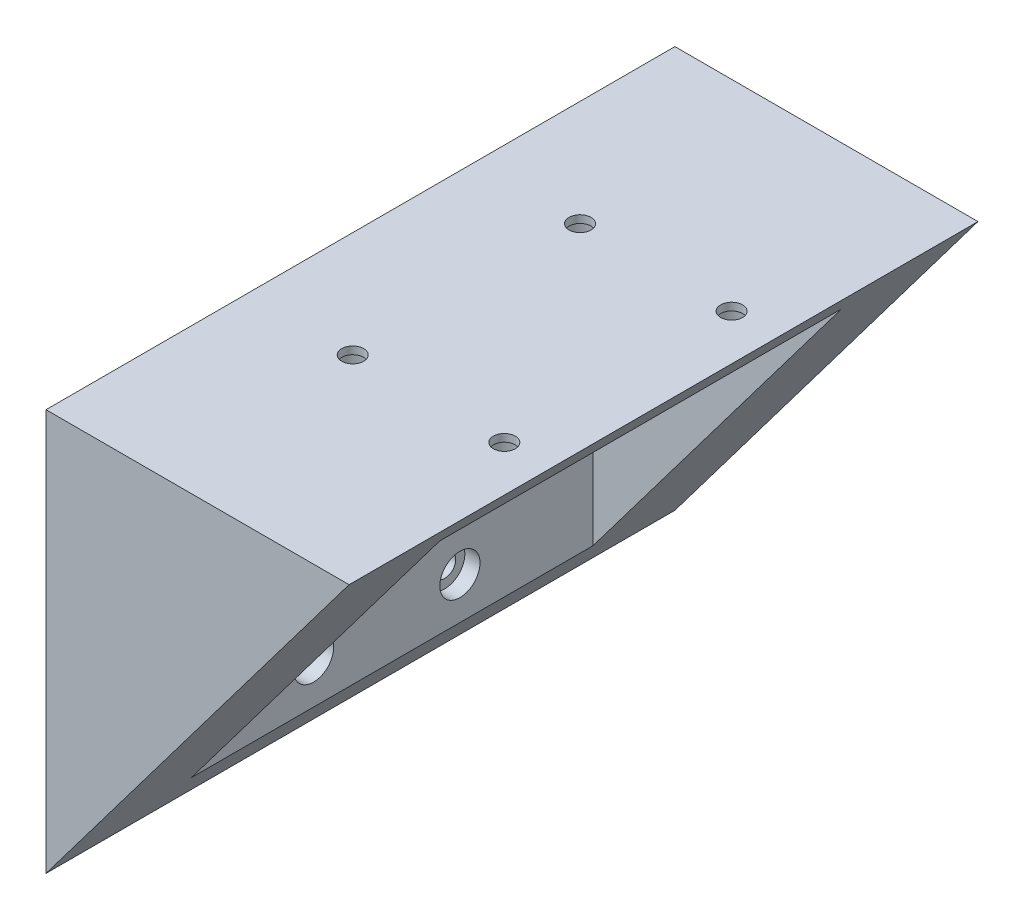
ISO-10303-21;
HEADER;
FILE_DESCRIPTION(('STEP AP214'),'2;1');
FILE_NAME('part.step','',(''),(''),'','','');
FILE_SCHEMA(('AUTOMOTIVE_DESIGN { 1 0 10303 214 1 1 1 1 }'));
ENDSEC;
DATA;
#1=APPLICATION_CONTEXT('core data for automotive mechanical design processes');
#2=APPLICATION_PROTOCOL_DEFINITION('international standard','automotive_design',2000,#1);
#3=PRODUCT_CONTEXT('',#1,'mechanical');
#4=PRODUCT('Part','Part','',(#3));
#5=PRODUCT_RELATED_PRODUCT_CATEGORY('part','',(#4));
#6=PRODUCT_DEFINITION_FORMATION('','',#4);
#7=PRODUCT_DEFINITION_CONTEXT('part definition',#1,'design');
#8=PRODUCT_DEFINITION('design','',#6,#7);
#9=PRODUCT_DEFINITION_SHAPE('','',#8);
#10=(LENGTH_UNIT() NAMED_UNIT(*) SI_UNIT(.MILLI.,.METRE.));
#11=(NAMED_UNIT(*) PLANE_ANGLE_UNIT() SI_UNIT($,.RADIAN.));
#12=(NAMED_UNIT(*) SI_UNIT($,.STERADIAN.) SOLID_ANGLE_UNIT());
#13=UNCERTAINTY_MEASURE_WITH_UNIT(LENGTH_MEASURE(1.E-05),#10,'distance_accuracy_value','');
#14=(GEOMETRIC_REPRESENTATION_CONTEXT(3) GLOBAL_UNCERTAINTY_ASSIGNED_CONTEXT((#13)) GLOBAL_UNIT_ASSIGNED_CONTEXT((#10,
#11,#12)) REPRESENTATION_CONTEXT('',''));
#15=CARTESIAN_POINT('',(0.,0.,0.));
#16=DIRECTION('',(0.,0.,1.));
#17=DIRECTION('',(1.,0.,0.));
#18=AXIS2_PLACEMENT_3D('',#15,#16,#17);
#19=CARTESIAN_POINT('',(-5.82641509433961,-28.6868552036199,51.86));
#20=DIRECTION('',(1.,0.,0.));
#21=DIRECTION('',(0.,1.,0.));
#22=AXIS2_PLACEMENT_3D('',#19,#20,#21);
#23=CYLINDRICAL_SURFACE('',#22,1.45);
#24=CARTESIAN_POINT('',(0.,-28.6868552036199,51.86));
#25=DIRECTION('',(1.,0.,0.));
#26=DIRECTION('',(0.,1.,0.));
#27=AXIS2_PLACEMENT_3D('',#24,#25,#26);
#28=CIRCLE('',#27,1.45);
#29=CARTESIAN_POINT('',(0.,-27.2368552036199,51.86));
#30=VERTEX_POINT('',#29);
#31=EDGE_CURVE('E201',#30,#30,#28,.T.);
#32=ORIENTED_EDGE('',*,*,#31,.F.);
#33=EDGE_LOOP('',(#32));
#34=FACE_BOUND('',#33,.T.);
#35=CARTESIAN_POINT('',(2.17358490566039,-28.6868552036199,51.86));
#36=DIRECTION('',(1.,0.,0.));
#37=DIRECTION('',(0.,1.,0.));
#38=AXIS2_PLACEMENT_3D('',#35,#36,#37);
#39=CIRCLE('',#38,1.45);
#40=CARTESIAN_POINT('',(2.17358490566039,-27.2368552036199,51.86));
#41=VERTEX_POINT('',#40);
#42=EDGE_CURVE('E36',#41,#41,#39,.F.);
#43=ORIENTED_EDGE('',*,*,#42,.F.);
#44=EDGE_LOOP('',(#43));
#45=FACE_BOUND('',#44,.T.);
#46=ADVANCED_FACE('F32',(#34,#45),#23,.F.);
#47=CARTESIAN_POINT('',(-5.82641509433961,-39.6368552036199,51.86));
#48=DIRECTION('',(1.,0.,0.));
#49=DIRECTION('',(0.,1.,0.));
#50=AXIS2_PLACEMENT_3D('',#47,#48,#49);
#51=CYLINDRICAL_SURFACE('',#50,1.45);
#52=CARTESIAN_POINT('',(0.,-39.6368552036199,51.86));
#53=DIRECTION('',(1.,0.,0.));
#54=DIRECTION('',(0.,1.,0.));
#55=AXIS2_PLACEMENT_3D('',#52,#53,#54);
#56=CIRCLE('',#55,1.45);
#57=CARTESIAN_POINT('',(0.,-38.1868552036199,51.86));
#58=VERTEX_POINT('',#57);
#59=EDGE_CURVE('E204',#58,#58,#56,.T.);
#60=ORIENTED_EDGE('',*,*,#59,.F.);
#61=EDGE_LOOP('',(#60));
#62=FACE_BOUND('',#61,.T.);
#63=CARTESIAN_POINT('',(2.17358490566039,-39.6368552036199,51.86));
#64=DIRECTION('',(1.,0.,0.));
#65=DIRECTION('',(0.,1.,0.));
#66=AXIS2_PLACEMENT_3D('',#63,#64,#65);
#67=CIRCLE('',#66,1.45);
#68=CARTESIAN_POINT('',(2.17358490566039,-38.1868552036199,51.86));
#69=VERTEX_POINT('',#68);
#70=EDGE_CURVE('E156',#69,#69,#67,.F.);
#71=ORIENTED_EDGE('',*,*,#70,.F.);
#72=EDGE_LOOP('',(#71));
#73=FACE_BOUND('',#72,.T.);
#74=ADVANCED_FACE('F233',(#62,#73),#51,.F.);
#75=CARTESIAN_POINT('',(-5.82641509433961,-39.6368552036199,32.5485809376953));
#76=DIRECTION('',(1.,0.,0.));
#77=DIRECTION('',(0.,1.,0.));
#78=AXIS2_PLACEMENT_3D('',#75,#76,#77);
#79=CYLINDRICAL_SURFACE('',#78,1.45);
#80=CARTESIAN_POINT('',(0.,-39.6368552036199,32.5485809376953));
#81=DIRECTION('',(1.,0.,0.));
#82=DIRECTION('',(0.,1.,0.));
#83=AXIS2_PLACEMENT_3D('',#80,#81,#82);
#84=CIRCLE('',#83,1.45);
#85=CARTESIAN_POINT('',(0.,-38.1868552036199,32.5485809376953));
#86=VERTEX_POINT('',#85);
#87=EDGE_CURVE('E207',#86,#86,#84,.T.);
#88=ORIENTED_EDGE('',*,*,#87,.F.);
#89=EDGE_LOOP('',(#88));
#90=FACE_BOUND('',#89,.T.);
#91=CARTESIAN_POINT('',(2.17358490566039,-39.6368552036199,32.5485809376953));
#92=DIRECTION('',(1.,0.,0.));
#93=DIRECTION('',(0.,1.,0.));
#94=AXIS2_PLACEMENT_3D('',#91,#92,#93);
#95=CIRCLE('',#94,1.45);
#96=CARTESIAN_POINT('',(2.17358490566039,-38.1868552036199,32.5485809376953));
#97=VERTEX_POINT('',#96);
#98=EDGE_CURVE('E153',#97,#97,#95,.F.);
#99=ORIENTED_EDGE('',*,*,#98,.F.);
#100=EDGE_LOOP('',(#99));
#101=FACE_BOUND('',#100,.T.);
#102=ADVANCED_FACE('F240',(#90,#101),#79,.F.);
#103=CARTESIAN_POINT('',(-5.82641509433961,-28.6868552036199,32.5485809376953));
#104=DIRECTION('',(1.,0.,0.));
#105=DIRECTION('',(0.,1.,0.));
#106=AXIS2_PLACEMENT_3D('',#103,#104,#105);
#107=CYLINDRICAL_SURFACE('',#106,1.45);
#108=CARTESIAN_POINT('',(0.,-28.6868552036199,32.5485809376953));
#109=DIRECTION('',(1.,0.,0.));
#110=DIRECTION('',(0.,1.,0.));
#111=AXIS2_PLACEMENT_3D('',#108,#109,#110);
#112=CIRCLE('',#111,1.45);
#113=CARTESIAN_POINT('',(0.,-27.2368552036199,32.5485809376953));
#114=VERTEX_POINT('',#113);
#115=EDGE_CURVE('E210',#114,#114,#112,.T.);
#116=ORIENTED_EDGE('',*,*,#115,.F.);
#117=EDGE_LOOP('',(#116));
#118=FACE_BOUND('',#117,.T.);
#119=CARTESIAN_POINT('',(2.17358490566039,-28.6868552036199,32.5485809376953));
#120=DIRECTION('',(1.,0.,0.));
#121=DIRECTION('',(0.,1.,0.));
#122=AXIS2_PLACEMENT_3D('',#119,#120,#121);
#123=CIRCLE('',#122,1.45);
#124=CARTESIAN_POINT('',(2.17358490566039,-27.2368552036199,32.5485809376953));
#125=VERTEX_POINT('',#124);
#126=EDGE_CURVE('E150',#125,#125,#123,.F.);
#127=ORIENTED_EDGE('',*,*,#126,.F.);
#128=EDGE_LOOP('',(#127));
#129=FACE_BOUND('',#128,.T.);
#130=ADVANCED_FACE('F246',(#118,#129),#107,.F.);
#131=CARTESIAN_POINT('',(33.9811320754717,8.33314479638009,56.5));
#132=DIRECTION('',(0.,-1.,0.));
#133=DIRECTION('',(1.,0.,0.));
#134=AXIS2_PLACEMENT_3D('',#131,#132,#133);
#135=CYLINDRICAL_SURFACE('',#134,1.45);
#136=CARTESIAN_POINT('',(33.9811320754717,2.33314479638009,56.5));
#137=DIRECTION('',(0.,-1.,0.));
#138=DIRECTION('',(0.,0.,-1.));
#139=AXIS2_PLACEMENT_3D('',#136,#137,#138);
#140=CIRCLE('',#139,1.45);
#141=CARTESIAN_POINT('',(33.9811320754717,2.33314479638009,55.05));
#142=VERTEX_POINT('',#141);
#143=EDGE_CURVE('E149',#142,#142,#140,.T.);
#144=ORIENTED_EDGE('',*,*,#143,.F.);
#145=EDGE_LOOP('',(#144));
#146=FACE_BOUND('',#145,.T.);
#147=CARTESIAN_POINT('',(33.9811320754717,1.33314479638009,56.5));
#148=DIRECTION('',(0.,-1.,0.));
#149=DIRECTION('',(1.,0.,0.));
#150=AXIS2_PLACEMENT_3D('',#147,#148,#149);
#151=CIRCLE('',#150,1.45);
#152=CARTESIAN_POINT('',(35.4311320754717,1.33314479638009,56.5));
#153=VERTEX_POINT('',#152);
#154=EDGE_CURVE('E146',#153,#153,#151,.F.);
#155=ORIENTED_EDGE('',*,*,#154,.F.);
#156=EDGE_LOOP('',(#155));
#157=FACE_BOUND('',#156,.T.);
#158=ADVANCED_FACE('F249',(#146,#157),#135,.F.);
#159=CARTESIAN_POINT('',(13.9811320754717,8.33314479638009,56.5));
#160=DIRECTION('',(0.,-1.,0.));
#161=DIRECTION('',(1.,0.,0.));
#162=AXIS2_PLACEMENT_3D('',#159,#160,#161);
#163=CYLINDRICAL_SURFACE('',#162,1.45);
#164=CARTESIAN_POINT('',(13.9811320754717,2.33314479638009,56.5));
#165=DIRECTION('',(0.,-1.,0.));
#166=DIRECTION('',(0.,0.,-1.));
#167=AXIS2_PLACEMENT_3D('',#164,#165,#166);
#168=CIRCLE('',#167,1.45);
#169=CARTESIAN_POINT('',(13.9811320754717,2.33314479638009,55.05));
#170=VERTEX_POINT('',#169);
#171=EDGE_CURVE('E192',#170,#170,#168,.T.);
#172=ORIENTED_EDGE('',*,*,#171,.F.);
#173=EDGE_LOOP('',(#172));
#174=FACE_BOUND('',#173,.T.);
#175=CARTESIAN_POINT('',(13.9811320754717,1.33314479638009,56.5));
#176=DIRECTION('',(0.,-1.,0.));
#177=DIRECTION('',(1.,0.,0.));
#178=AXIS2_PLACEMENT_3D('',#175,#176,#177);
#179=CIRCLE('',#178,1.45);
#180=CARTESIAN_POINT('',(15.4311320754717,1.33314479638009,56.5));
#181=VERTEX_POINT('',#180);
#182=EDGE_CURVE('E143',#181,#181,#179,.F.);
#183=ORIENTED_EDGE('',*,*,#182,.F.);
#184=EDGE_LOOP('',(#183));
#185=FACE_BOUND('',#184,.T.);
#186=ADVANCED_FACE('F256',(#174,#185),#163,.F.);
#187=CARTESIAN_POINT('',(13.9811320754717,8.33314479638009,26.5));
#188=DIRECTION('',(0.,-1.,0.));
#189=DIRECTION('',(1.,0.,0.));
#190=AXIS2_PLACEMENT_3D('',#187,#188,#189);
#191=CYLINDRICAL_SURFACE('',#190,1.45);
#192=CARTESIAN_POINT('',(13.9811320754717,2.33314479638009,26.5));
#193=DIRECTION('',(0.,-1.,0.));
#194=DIRECTION('',(0.,0.,-1.));
#195=AXIS2_PLACEMENT_3D('',#192,#193,#194);
#196=CIRCLE('',#195,1.45);
#197=CARTESIAN_POINT('',(13.9811320754717,2.33314479638009,25.05));
#198=VERTEX_POINT('',#197);
#199=EDGE_CURVE('E195',#198,#198,#196,.T.);
#200=ORIENTED_EDGE('',*,*,#199,.F.);
#201=EDGE_LOOP('',(#200));
#202=FACE_BOUND('',#201,.T.);
#203=CARTESIAN_POINT('',(13.9811320754717,1.33314479638009,26.5));
#204=DIRECTION('',(0.,-1.,0.));
#205=DIRECTION('',(1.,0.,0.));
#206=AXIS2_PLACEMENT_3D('',#203,#204,#205);
#207=CIRCLE('',#206,1.45);
#208=CARTESIAN_POINT('',(15.4311320754717,1.33314479638009,26.5));
#209=VERTEX_POINT('',#208);
#210=EDGE_CURVE('E139',#209,#209,#207,.F.);
#211=ORIENTED_EDGE('',*,*,#210,.F.);
#212=EDGE_LOOP('',(#211));
#213=FACE_BOUND('',#212,.T.);
#214=ADVANCED_FACE('F261',(#202,#213),#191,.F.);
#215=CARTESIAN_POINT('',(33.9811320754717,8.33314479638009,26.5));
#216=DIRECTION('',(0.,-1.,0.));
#217=DIRECTION('',(1.,0.,0.));
#218=AXIS2_PLACEMENT_3D('',#215,#216,#217);
#219=CYLINDRICAL_SURFACE('',#218,1.45);
#220=CARTESIAN_POINT('',(33.9811320754717,2.33314479638009,26.5));
#221=DIRECTION('',(0.,-1.,0.));
#222=DIRECTION('',(0.,0.,-1.));
#223=AXIS2_PLACEMENT_3D('',#220,#221,#222);
#224=CIRCLE('',#223,1.45);
#225=CARTESIAN_POINT('',(33.9811320754717,2.33314479638009,25.05));
#226=VERTEX_POINT('',#225);
#227=EDGE_CURVE('E198',#226,#226,#224,.T.);
#228=ORIENTED_EDGE('',*,*,#227,.F.);
#229=EDGE_LOOP('',(#228));
#230=FACE_BOUND('',#229,.T.);
#231=CARTESIAN_POINT('',(33.9811320754717,1.33314479638009,26.5));
#232=DIRECTION('',(0.,-1.,0.));
#233=DIRECTION('',(1.,0.,0.));
#234=AXIS2_PLACEMENT_3D('',#231,#232,#233);
#235=CIRCLE('',#234,1.45);
#236=CARTESIAN_POINT('',(35.4311320754717,1.33314479638009,26.5));
#237=VERTEX_POINT('',#236);
#238=EDGE_CURVE('E136',#237,#237,#235,.F.);
#239=ORIENTED_EDGE('',*,*,#238,.F.);
#240=EDGE_LOOP('',(#239));
#241=FACE_BOUND('',#240,.T.);
#242=ADVANCED_FACE('F258',(#230,#241),#219,.F.);
#243=CARTESIAN_POINT('',(40.,2.33314479638009,83.));
#244=DIRECTION('',(-0.798189150333231,0.602406905911872,0.));
#245=DIRECTION('',(-0.602406905911872,-0.798189150333231,0.));
#246=AXIS2_PLACEMENT_3D('',#243,#244,#245);
#247=PLANE('',#246);
#248=DIRECTION('',(0.602406905911872,0.798189150333231,0.));
#249=VECTOR('',#248,1.);
#250=CARTESIAN_POINT('',(40.,2.33314479638009,0.));
#251=LINE('',#250,#249);
#252=CARTESIAN_POINT('',(0.,-50.6668552036199,0.));
#253=VERTEX_POINT('',#252);
#254=CARTESIAN_POINT('',(40.,2.33314479638009,0.));
#255=VERTEX_POINT('',#254);
#256=EDGE_CURVE('E75',#253,#255,#251,.T.);
#257=ORIENTED_EDGE('',*,*,#256,.T.);
#258=DIRECTION('',(0.,0.,-1.));
#259=VECTOR('',#258,1.);
#260=CARTESIAN_POINT('',(40.,2.33314479638009,83.));
#261=LINE('',#260,#259);
#262=CARTESIAN_POINT('',(40.,2.33314479638009,83.));
#263=VERTEX_POINT('',#262);
#264=EDGE_CURVE('E127',#263,#255,#261,.T.);
#265=ORIENTED_EDGE('',*,*,#264,.F.);
#266=DIRECTION('',(0.602406905911872,0.798189150333231,0.));
#267=VECTOR('',#266,1.);
#268=CARTESIAN_POINT('',(40.,2.33314479638009,83.));
#269=LINE('',#268,#267);
#270=CARTESIAN_POINT('',(0.,-50.6668552036199,83.));
#271=VERTEX_POINT('',#270);
#272=EDGE_CURVE('E58',#271,#263,#269,.T.);
#273=ORIENTED_EDGE('',*,*,#272,.F.);
#274=DIRECTION('',(0.,0.,-1.));
#275=VECTOR('',#274,1.);
#276=CARTESIAN_POINT('',(0.,-50.6668552036199,83.));
#277=LINE('',#276,#275);
#278=EDGE_CURVE('E41',#271,#253,#277,.T.);
#279=ORIENTED_EDGE('',*,*,#278,.T.);
#280=EDGE_LOOP('',(#257,#265,#273,#279));
#281=FACE_BOUND('',#280,.T.);
#282=DIRECTION('',(0.602406905911872,0.798189150333231,0.));
#283=VECTOR('',#282,1.);
#284=CARTESIAN_POINT('',(4.17358490566039,-45.1368552036199,15.));
#285=LINE('',#284,#283);
#286=CARTESIAN_POINT('',(4.17358490566039,-45.1368552036199,15.));
#287=VERTEX_POINT('',#286);
#288=CARTESIAN_POINT('',(36.9811320754717,-1.66685520361991,15.));
#289=VERTEX_POINT('',#288);
#290=EDGE_CURVE('E107',#287,#289,#285,.T.);
#291=ORIENTED_EDGE('',*,*,#290,.F.);
#292=DIRECTION('',(0.,0.,1.));
#293=VECTOR('',#292,1.);
#294=CARTESIAN_POINT('',(4.17358490566039,-45.1368552036199,15.));
#295=LINE('',#294,#293);
#296=CARTESIAN_POINT('',(4.17358490566039,-45.1368552036199,68.));
#297=VERTEX_POINT('',#296);
#298=EDGE_CURVE('E118',#287,#297,#295,.T.);
#299=ORIENTED_EDGE('',*,*,#298,.T.);
#300=DIRECTION('',(0.602406905911872,0.798189150333231,0.));
#301=VECTOR('',#300,1.);
#302=CARTESIAN_POINT('',(4.17358490566039,-45.1368552036199,68.));
#303=LINE('',#302,#301);
#304=CARTESIAN_POINT('',(36.9811320754717,-1.66685520361991,68.));
#305=VERTEX_POINT('',#304);
#306=EDGE_CURVE('E116',#297,#305,#303,.T.);
#307=ORIENTED_EDGE('',*,*,#306,.T.);
#308=DIRECTION('',(0.,0.,1.));
#309=VECTOR('',#308,1.);
#310=CARTESIAN_POINT('',(36.9811320754717,-1.66685520361991,15.));
#311=LINE('',#310,#309);
#312=EDGE_CURVE('E100',#289,#305,#311,.T.);
#313=ORIENTED_EDGE('',*,*,#312,.F.);
#314=EDGE_LOOP('',(#291,#299,#307,#313));
#315=FACE_BOUND('',#314,.T.);
#316=ADVANCED_FACE('F115',(#281,#315),#247,.F.);
#317=CARTESIAN_POINT('',(0.,2.33314479638009,83.));
#318=DIRECTION('',(0.,-1.,0.));
#319=DIRECTION('',(0.,0.,-1.));
#320=AXIS2_PLACEMENT_3D('',#317,#318,#319);
#321=PLANE('',#320);
#322=ORIENTED_EDGE('',*,*,#227,.T.);
#323=EDGE_LOOP('',(#322));
#324=FACE_BOUND('',#323,.T.);
#325=ORIENTED_EDGE('',*,*,#199,.T.);
#326=EDGE_LOOP('',(#325));
#327=FACE_BOUND('',#326,.T.);
#328=ORIENTED_EDGE('',*,*,#171,.T.);
#329=EDGE_LOOP('',(#328));
#330=FACE_BOUND('',#329,.T.);
#331=ORIENTED_EDGE('',*,*,#143,.T.);
#332=EDGE_LOOP('',(#331));
#333=FACE_BOUND('',#332,.T.);
#334=DIRECTION('',(-1.,0.,0.));
#335=VECTOR('',#334,1.);
#336=CARTESIAN_POINT('',(0.,2.33314479638009,0.));
#337=LINE('',#336,#335);
#338=CARTESIAN_POINT('',(0.,2.33314479638009,0.));
#339=VERTEX_POINT('',#338);
#340=EDGE_CURVE('E128',#255,#339,#337,.T.);
#341=ORIENTED_EDGE('',*,*,#340,.T.);
#342=DIRECTION('',(0.,0.,-1.));
#343=VECTOR('',#342,1.);
#344=CARTESIAN_POINT('',(0.,2.33314479638009,83.));
#345=LINE('',#344,#343);
#346=CARTESIAN_POINT('',(0.,2.33314479638009,83.));
#347=VERTEX_POINT('',#346);
#348=EDGE_CURVE('E11',#347,#339,#345,.T.);
#349=ORIENTED_EDGE('',*,*,#348,.F.);
#350=DIRECTION('',(-1.,0.,0.));
#351=VECTOR('',#350,1.);
#352=CARTESIAN_POINT('',(0.,2.33314479638009,83.));
#353=LINE('',#352,#351);
#354=EDGE_CURVE('E123',#263,#347,#353,.T.);
#355=ORIENTED_EDGE('',*,*,#354,.F.);
#356=ORIENTED_EDGE('',*,*,#264,.T.);
#357=EDGE_LOOP('',(#341,#349,#355,#356));
#358=FACE_BOUND('',#357,.T.);
#359=ADVANCED_FACE('F34',(#324,#327,#330,#333,#358),#321,.F.);
#360=CARTESIAN_POINT('',(0.,2.33314479638009,83.));
#361=DIRECTION('',(1.,0.,0.));
#362=DIRECTION('',(0.,1.,0.));
#363=AXIS2_PLACEMENT_3D('',#360,#361,#362);
#364=PLANE('',#363);
#365=ORIENTED_EDGE('',*,*,#115,.T.);
#366=EDGE_LOOP('',(#365));
#367=FACE_BOUND('',#366,.T.);
#368=ORIENTED_EDGE('',*,*,#87,.T.);
#369=EDGE_LOOP('',(#368));
#370=FACE_BOUND('',#369,.T.);
#371=ORIENTED_EDGE('',*,*,#59,.T.);
#372=EDGE_LOOP('',(#371));
#373=FACE_BOUND('',#372,.T.);
#374=ORIENTED_EDGE('',*,*,#31,.T.);
#375=EDGE_LOOP('',(#374));
#376=FACE_BOUND('',#375,.T.);
#377=DIRECTION('',(0.,-1.,0.));
#378=VECTOR('',#377,1.);
#379=CARTESIAN_POINT('',(0.,2.33314479638009,0.));
#380=LINE('',#379,#378);
#381=EDGE_CURVE('E131',#339,#253,#380,.T.);
#382=ORIENTED_EDGE('',*,*,#381,.T.);
#383=ORIENTED_EDGE('',*,*,#278,.F.);
#384=DIRECTION('',(0.,-1.,0.));
#385=VECTOR('',#384,1.);
#386=CARTESIAN_POINT('',(0.,2.33314479638009,83.));
#387=LINE('',#386,#385);
#388=EDGE_CURVE('E80',#347,#271,#387,.T.);
#389=ORIENTED_EDGE('',*,*,#388,.F.);
#390=ORIENTED_EDGE('',*,*,#348,.T.);
#391=EDGE_LOOP('',(#382,#383,#389,#390));
#392=FACE_BOUND('',#391,.T.);
#393=ADVANCED_FACE('F375',(#367,#370,#373,#376,#392),#364,.F.);
#394=CARTESIAN_POINT('',(0.,0.,83.));
#395=DIRECTION('',(0.,0.,-1.));
#396=DIRECTION('',(-1.,0.,0.));
#397=AXIS2_PLACEMENT_3D('',#394,#395,#396);
#398=PLANE('',#397);
#399=ORIENTED_EDGE('',*,*,#354,.T.);
#400=ORIENTED_EDGE('',*,*,#388,.T.);
#401=ORIENTED_EDGE('',*,*,#272,.T.);
#402=EDGE_LOOP('',(#399,#400,#401));
#403=FACE_BOUND('',#402,.T.);
#404=ADVANCED_FACE('F368',(#403),#398,.F.);
#405=CARTESIAN_POINT('',(0.,0.,0.));
#406=DIRECTION('',(0.,0.,-1.));
#407=DIRECTION('',(-1.,0.,0.));
#408=AXIS2_PLACEMENT_3D('',#405,#406,#407);
#409=PLANE('',#408);
#410=ORIENTED_EDGE('',*,*,#340,.F.);
#411=ORIENTED_EDGE('',*,*,#256,.F.);
#412=ORIENTED_EDGE('',*,*,#381,.F.);
#413=EDGE_LOOP('',(#410,#411,#412));
#414=FACE_BOUND('',#413,.T.);
#415=ADVANCED_FACE('F359',(#414),#409,.T.);
#416=CARTESIAN_POINT('',(4.17358490566038,-1.66685520361991,15.));
#417=DIRECTION('',(-1.,0.,0.));
#418=DIRECTION('',(0.,-1.,0.));
#419=AXIS2_PLACEMENT_3D('',#416,#417,#418);
#420=PLANE('',#419);
#421=CARTESIAN_POINT('',(4.17358490566039,-28.6868552036199,32.5485809376953));
#422=DIRECTION('',(1.,0.,0.));
#423=DIRECTION('',(0.,1.,0.));
#424=AXIS2_PLACEMENT_3D('',#421,#422,#423);
#425=CIRCLE('',#424,2.65);
#426=CARTESIAN_POINT('',(4.17358490566039,-26.0368552036199,32.5485809376953));
#427=VERTEX_POINT('',#426);
#428=EDGE_CURVE('E348',#427,#427,#425,.T.);
#429=ORIENTED_EDGE('',*,*,#428,.F.);
#430=EDGE_LOOP('',(#429));
#431=FACE_BOUND('',#430,.T.);
#432=CARTESIAN_POINT('',(4.17358490566039,-39.6368552036199,51.86));
#433=DIRECTION('',(1.,0.,0.));
#434=DIRECTION('',(0.,1.,0.));
#435=AXIS2_PLACEMENT_3D('',#432,#433,#434);
#436=CIRCLE('',#435,2.65);
#437=CARTESIAN_POINT('',(4.17358490566039,-36.9868552036199,51.86));
#438=VERTEX_POINT('',#437);
#439=EDGE_CURVE('E335',#438,#438,#436,.T.);
#440=ORIENTED_EDGE('',*,*,#439,.F.);
#441=EDGE_LOOP('',(#440));
#442=FACE_BOUND('',#441,.T.);
#443=CARTESIAN_POINT('',(4.17358490566039,-39.6368552036199,32.5485809376953));
#444=DIRECTION('',(1.,0.,0.));
#445=DIRECTION('',(0.,1.,0.));
#446=AXIS2_PLACEMENT_3D('',#443,#444,#445);
#447=CIRCLE('',#446,2.65);
#448=CARTESIAN_POINT('',(4.17358490566039,-36.9868552036199,32.5485809376953));
#449=VERTEX_POINT('',#448);
#450=EDGE_CURVE('E336',#449,#449,#447,.T.);
#451=ORIENTED_EDGE('',*,*,#450,.F.);
#452=EDGE_LOOP('',(#451));
#453=FACE_BOUND('',#452,.T.);
#454=CARTESIAN_POINT('',(4.17358490566039,-28.6868552036199,51.86));
#455=DIRECTION('',(1.,0.,0.));
#456=DIRECTION('',(0.,1.,0.));
#457=AXIS2_PLACEMENT_3D('',#454,#455,#456);
#458=CIRCLE('',#457,2.65);
#459=CARTESIAN_POINT('',(4.17358490566039,-26.0368552036199,51.86));
#460=VERTEX_POINT('',#459);
#461=EDGE_CURVE('E347',#460,#460,#458,.T.);
#462=ORIENTED_EDGE('',*,*,#461,.F.);
#463=EDGE_LOOP('',(#462));
#464=FACE_BOUND('',#463,.T.);
#465=DIRECTION('',(0.,-1.,0.));
#466=VECTOR('',#465,1.);
#467=CARTESIAN_POINT('',(4.17358490566038,-1.66685520361991,68.));
#468=LINE('',#467,#466);
#469=CARTESIAN_POINT('',(4.17358490566038,-1.66685520361991,68.));
#470=VERTEX_POINT('',#469);
#471=EDGE_CURVE('E113',#470,#297,#468,.T.);
#472=ORIENTED_EDGE('',*,*,#471,.T.);
#473=ORIENTED_EDGE('',*,*,#298,.F.);
#474=DIRECTION('',(0.,-1.,0.));
#475=VECTOR('',#474,1.);
#476=CARTESIAN_POINT('',(4.17358490566038,-1.66685520361991,15.));
#477=LINE('',#476,#475);
#478=CARTESIAN_POINT('',(4.17358490566038,-1.66685520361991,15.));
#479=VERTEX_POINT('',#478);
#480=EDGE_CURVE('E106',#479,#287,#477,.T.);
#481=ORIENTED_EDGE('',*,*,#480,.F.);
#482=DIRECTION('',(0.,0.,1.));
#483=VECTOR('',#482,1.);
#484=CARTESIAN_POINT('',(4.17358490566038,-1.66685520361991,15.));
#485=LINE('',#484,#483);
#486=EDGE_CURVE('E102',#479,#470,#485,.T.);
#487=ORIENTED_EDGE('',*,*,#486,.T.);
#488=EDGE_LOOP('',(#472,#473,#481,#487));
#489=FACE_BOUND('',#488,.T.);
#490=ADVANCED_FACE('F217',(#431,#442,#453,#464,#489),#420,.F.);
#491=CARTESIAN_POINT('',(36.9811320754717,-1.66685520361991,15.));
#492=DIRECTION('',(0.,1.,0.));
#493=DIRECTION('',(-1.,0.,0.));
#494=AXIS2_PLACEMENT_3D('',#491,#492,#493);
#495=PLANE('',#494);
#496=CARTESIAN_POINT('',(33.9811320754717,-1.66685520361991,56.5));
#497=DIRECTION('',(0.,-1.,0.));
#498=DIRECTION('',(1.,0.,0.));
#499=AXIS2_PLACEMENT_3D('',#496,#497,#498);
#500=CIRCLE('',#499,2.8);
#501=CARTESIAN_POINT('',(36.7811320754717,-1.66685520361991,56.5));
#502=VERTEX_POINT('',#501);
#503=EDGE_CURVE('E178',#502,#502,#500,.T.);
#504=ORIENTED_EDGE('',*,*,#503,.F.);
#505=EDGE_LOOP('',(#504));
#506=FACE_BOUND('',#505,.T.);
#507=CARTESIAN_POINT('',(13.9811320754717,-1.66685520361991,26.5));
#508=DIRECTION('',(0.,-1.,0.));
#509=DIRECTION('',(1.,0.,0.));
#510=AXIS2_PLACEMENT_3D('',#507,#508,#509);
#511=CIRCLE('',#510,2.8);
#512=CARTESIAN_POINT('',(16.7811320754717,-1.66685520361991,26.5));
#513=VERTEX_POINT('',#512);
#514=EDGE_CURVE('E170',#513,#513,#511,.T.);
#515=ORIENTED_EDGE('',*,*,#514,.F.);
#516=EDGE_LOOP('',(#515));
#517=FACE_BOUND('',#516,.T.);
#518=CARTESIAN_POINT('',(33.9811320754717,-1.66685520361991,26.5));
#519=DIRECTION('',(0.,-1.,0.));
#520=DIRECTION('',(1.,0.,0.));
#521=AXIS2_PLACEMENT_3D('',#518,#519,#520);
#522=CIRCLE('',#521,2.8);
#523=CARTESIAN_POINT('',(36.7811320754717,-1.66685520361991,26.5));
#524=VERTEX_POINT('',#523);
#525=EDGE_CURVE('E161',#524,#524,#522,.T.);
#526=ORIENTED_EDGE('',*,*,#525,.F.);
#527=EDGE_LOOP('',(#526));
#528=FACE_BOUND('',#527,.T.);
#529=CARTESIAN_POINT('',(13.9811320754717,-1.66685520361991,56.5));
#530=DIRECTION('',(0.,-1.,0.));
#531=DIRECTION('',(1.,0.,0.));
#532=AXIS2_PLACEMENT_3D('',#529,#530,#531);
#533=CIRCLE('',#532,2.8);
#534=CARTESIAN_POINT('',(16.7811320754717,-1.66685520361991,56.5));
#535=VERTEX_POINT('',#534);
#536=EDGE_CURVE('E177',#535,#535,#533,.T.);
#537=ORIENTED_EDGE('',*,*,#536,.F.);
#538=EDGE_LOOP('',(#537));
#539=FACE_BOUND('',#538,.T.);
#540=DIRECTION('',(-1.,0.,0.));
#541=VECTOR('',#540,1.);
#542=CARTESIAN_POINT('',(36.9811320754717,-1.66685520361991,68.));
#543=LINE('',#542,#541);
#544=EDGE_CURVE('E49',#305,#470,#543,.T.);
#545=ORIENTED_EDGE('',*,*,#544,.T.);
#546=ORIENTED_EDGE('',*,*,#486,.F.);
#547=DIRECTION('',(-1.,0.,0.));
#548=VECTOR('',#547,1.);
#549=CARTESIAN_POINT('',(36.9811320754717,-1.66685520361991,15.));
#550=LINE('',#549,#548);
#551=EDGE_CURVE('E96',#289,#479,#550,.T.);
#552=ORIENTED_EDGE('',*,*,#551,.F.);
#553=ORIENTED_EDGE('',*,*,#312,.T.);
#554=EDGE_LOOP('',(#545,#546,#552,#553));
#555=FACE_BOUND('',#554,.T.);
#556=ADVANCED_FACE('F98',(#506,#517,#528,#539,#555),#495,.F.);
#557=CARTESIAN_POINT('',(0.,0.,15.));
#558=DIRECTION('',(0.,0.,1.));
#559=DIRECTION('',(1.,0.,0.));
#560=AXIS2_PLACEMENT_3D('',#557,#558,#559);
#561=PLANE('',#560);
#562=ORIENTED_EDGE('',*,*,#290,.T.);
#563=ORIENTED_EDGE('',*,*,#551,.T.);
#564=ORIENTED_EDGE('',*,*,#480,.T.);
#565=EDGE_LOOP('',(#562,#563,#564));
#566=FACE_BOUND('',#565,.T.);
#567=ADVANCED_FACE('F110',(#566),#561,.T.);
#568=CARTESIAN_POINT('',(0.,0.,68.));
#569=DIRECTION('',(0.,0.,1.));
#570=DIRECTION('',(1.,0.,0.));
#571=AXIS2_PLACEMENT_3D('',#568,#569,#570);
#572=PLANE('',#571);
#573=ORIENTED_EDGE('',*,*,#306,.F.);
#574=ORIENTED_EDGE('',*,*,#471,.F.);
#575=ORIENTED_EDGE('',*,*,#544,.F.);
#576=EDGE_LOOP('',(#573,#574,#575));
#577=FACE_BOUND('',#576,.T.);
#578=ADVANCED_FACE('F218',(#577),#572,.F.);
#579=CARTESIAN_POINT('',(33.9811320754717,1.33314479638009,26.5));
#580=DIRECTION('',(0.,-1.,0.));
#581=DIRECTION('',(1.,0.,0.));
#582=AXIS2_PLACEMENT_3D('',#579,#580,#581);
#583=PLANE('',#582);
#584=CARTESIAN_POINT('',(33.9811320754717,1.33314479638009,26.5));
#585=DIRECTION('',(0.,-1.,0.));
#586=DIRECTION('',(1.,0.,0.));
#587=AXIS2_PLACEMENT_3D('',#584,#585,#586);
#588=CIRCLE('',#587,2.8);
#589=CARTESIAN_POINT('',(36.7811320754717,1.33314479638009,26.5));
#590=VERTEX_POINT('',#589);
#591=EDGE_CURVE('E165',#590,#590,#588,.T.);
#592=ORIENTED_EDGE('',*,*,#591,.T.);
#593=EDGE_LOOP('',(#592));
#594=FACE_BOUND('',#593,.T.);
#595=ORIENTED_EDGE('',*,*,#238,.T.);
#596=EDGE_LOOP('',(#595));
#597=FACE_BOUND('',#596,.T.);
#598=ADVANCED_FACE('F220',(#594,#597),#583,.T.);
#599=CARTESIAN_POINT('',(33.9811320754717,1.33314479638009,26.5));
#600=DIRECTION('',(0.,-1.,0.));
#601=DIRECTION('',(1.,0.,0.));
#602=AXIS2_PLACEMENT_3D('',#599,#600,#601);
#603=CYLINDRICAL_SURFACE('',#602,2.8);
#604=ORIENTED_EDGE('',*,*,#591,.F.);
#605=EDGE_LOOP('',(#604));
#606=FACE_BOUND('',#605,.T.);
#607=ORIENTED_EDGE('',*,*,#525,.T.);
#608=EDGE_LOOP('',(#607));
#609=FACE_BOUND('',#608,.T.);
#610=ADVANCED_FACE('F227',(#606,#609),#603,.F.);
#611=CARTESIAN_POINT('',(13.9811320754717,1.33314479638009,26.5));
#612=DIRECTION('',(0.,-1.,0.));
#613=DIRECTION('',(1.,0.,0.));
#614=AXIS2_PLACEMENT_3D('',#611,#612,#613);
#615=PLANE('',#614);
#616=CARTESIAN_POINT('',(13.9811320754717,1.33314479638009,26.5));
#617=DIRECTION('',(0.,-1.,0.));
#618=DIRECTION('',(1.,0.,0.));
#619=AXIS2_PLACEMENT_3D('',#616,#617,#618);
#620=CIRCLE('',#619,2.8);
#621=CARTESIAN_POINT('',(16.7811320754717,1.33314479638009,26.5));
#622=VERTEX_POINT('',#621);
#623=EDGE_CURVE('E181',#622,#622,#620,.T.);
#624=ORIENTED_EDGE('',*,*,#623,.T.);
#625=EDGE_LOOP('',(#624));
#626=FACE_BOUND('',#625,.T.);
#627=ORIENTED_EDGE('',*,*,#210,.T.);
#628=EDGE_LOOP('',(#627));
#629=FACE_BOUND('',#628,.T.);
#630=ADVANCED_FACE('F281',(#626,#629),#615,.T.);
#631=CARTESIAN_POINT('',(13.9811320754717,1.33314479638009,26.5));
#632=DIRECTION('',(0.,-1.,0.));
#633=DIRECTION('',(1.,0.,0.));
#634=AXIS2_PLACEMENT_3D('',#631,#632,#633);
#635=CYLINDRICAL_SURFACE('',#634,2.8);
#636=ORIENTED_EDGE('',*,*,#623,.F.);
#637=EDGE_LOOP('',(#636));
#638=FACE_BOUND('',#637,.T.);
#639=ORIENTED_EDGE('',*,*,#514,.T.);
#640=EDGE_LOOP('',(#639));
#641=FACE_BOUND('',#640,.T.);
#642=ADVANCED_FACE('F277',(#638,#641),#635,.F.);
#643=CARTESIAN_POINT('',(13.9811320754717,1.33314479638009,56.5));
#644=DIRECTION('',(0.,-1.,0.));
#645=DIRECTION('',(1.,0.,0.));
#646=AXIS2_PLACEMENT_3D('',#643,#644,#645);
#647=PLANE('',#646);
#648=CARTESIAN_POINT('',(13.9811320754717,1.33314479638009,56.5));
#649=DIRECTION('',(0.,-1.,0.));
#650=DIRECTION('',(1.,0.,0.));
#651=AXIS2_PLACEMENT_3D('',#648,#649,#650);
#652=CIRCLE('',#651,2.8);
#653=CARTESIAN_POINT('',(16.7811320754717,1.33314479638009,56.5));
#654=VERTEX_POINT('',#653);
#655=EDGE_CURVE('E140',#654,#654,#652,.T.);
#656=ORIENTED_EDGE('',*,*,#655,.T.);
#657=EDGE_LOOP('',(#656));
#658=FACE_BOUND('',#657,.T.);
#659=ORIENTED_EDGE('',*,*,#182,.T.);
#660=EDGE_LOOP('',(#659));
#661=FACE_BOUND('',#660,.T.);
#662=ADVANCED_FACE('F273',(#658,#661),#647,.T.);
#663=CARTESIAN_POINT('',(13.9811320754717,1.33314479638009,56.5));
#664=DIRECTION('',(0.,-1.,0.));
#665=DIRECTION('',(1.,0.,0.));
#666=AXIS2_PLACEMENT_3D('',#663,#664,#665);
#667=CYLINDRICAL_SURFACE('',#666,2.8);
#668=ORIENTED_EDGE('',*,*,#655,.F.);
#669=EDGE_LOOP('',(#668));
#670=FACE_BOUND('',#669,.T.);
#671=ORIENTED_EDGE('',*,*,#536,.T.);
#672=EDGE_LOOP('',(#671));
#673=FACE_BOUND('',#672,.T.);
#674=ADVANCED_FACE('F269',(#670,#673),#667,.F.);
#675=CARTESIAN_POINT('',(33.9811320754717,1.33314479638009,56.5));
#676=DIRECTION('',(0.,-1.,0.));
#677=DIRECTION('',(1.,0.,0.));
#678=AXIS2_PLACEMENT_3D('',#675,#676,#677);
#679=PLANE('',#678);
#680=CARTESIAN_POINT('',(33.9811320754717,1.33314479638009,56.5));
#681=DIRECTION('',(0.,-1.,0.));
#682=DIRECTION('',(1.,0.,0.));
#683=AXIS2_PLACEMENT_3D('',#680,#681,#682);
#684=CIRCLE('',#683,2.8);
#685=CARTESIAN_POINT('',(36.7811320754717,1.33314479638009,56.5));
#686=VERTEX_POINT('',#685);
#687=EDGE_CURVE('E174',#686,#686,#684,.T.);
#688=ORIENTED_EDGE('',*,*,#687,.T.);
#689=EDGE_LOOP('',(#688));
#690=FACE_BOUND('',#689,.T.);
#691=ORIENTED_EDGE('',*,*,#154,.T.);
#692=EDGE_LOOP('',(#691));
#693=FACE_BOUND('',#692,.T.);
#694=ADVANCED_FACE('F272',(#690,#693),#679,.T.);
#695=CARTESIAN_POINT('',(33.9811320754717,1.33314479638009,56.5));
#696=DIRECTION('',(0.,-1.,0.));
#697=DIRECTION('',(1.,0.,0.));
#698=AXIS2_PLACEMENT_3D('',#695,#696,#697);
#699=CYLINDRICAL_SURFACE('',#698,2.8);
#700=ORIENTED_EDGE('',*,*,#687,.F.);
#701=EDGE_LOOP('',(#700));
#702=FACE_BOUND('',#701,.T.);
#703=ORIENTED_EDGE('',*,*,#503,.T.);
#704=EDGE_LOOP('',(#703));
#705=FACE_BOUND('',#704,.T.);
#706=ADVANCED_FACE('F286',(#702,#705),#699,.F.);
#707=CARTESIAN_POINT('',(2.17358490566039,-28.6868552036199,32.5485809376953));
#708=DIRECTION('',(1.,0.,0.));
#709=DIRECTION('',(0.,1.,0.));
#710=AXIS2_PLACEMENT_3D('',#707,#708,#709);
#711=PLANE('',#710);
#712=CARTESIAN_POINT('',(2.17358490566039,-28.6868552036199,32.5485809376953));
#713=DIRECTION('',(1.,0.,0.));
#714=DIRECTION('',(0.,1.,0.));
#715=AXIS2_PLACEMENT_3D('',#712,#713,#714);
#716=CIRCLE('',#715,2.65);
#717=CARTESIAN_POINT('',(2.17358490566039,-26.0368552036199,32.5485809376953));
#718=VERTEX_POINT('',#717);
#719=EDGE_CURVE('E344',#718,#718,#716,.T.);
#720=ORIENTED_EDGE('',*,*,#719,.T.);
#721=EDGE_LOOP('',(#720));
#722=FACE_BOUND('',#721,.T.);
#723=ORIENTED_EDGE('',*,*,#126,.T.);
#724=EDGE_LOOP('',(#723));
#725=FACE_BOUND('',#724,.T.);
#726=ADVANCED_FACE('F289',(#722,#725),#711,.T.);
#727=CARTESIAN_POINT('',(2.17358490566039,-28.6868552036199,32.5485809376953));
#728=DIRECTION('',(1.,0.,0.));
#729=DIRECTION('',(0.,1.,0.));
#730=AXIS2_PLACEMENT_3D('',#727,#728,#729);
#731=CYLINDRICAL_SURFACE('',#730,2.65);
#732=ORIENTED_EDGE('',*,*,#719,.F.);
#733=EDGE_LOOP('',(#732));
#734=FACE_BOUND('',#733,.T.);
#735=ORIENTED_EDGE('',*,*,#428,.T.);
#736=EDGE_LOOP('',(#735));
#737=FACE_BOUND('',#736,.T.);
#738=ADVANCED_FACE('F314',(#734,#737),#731,.F.);
#739=CARTESIAN_POINT('',(2.17358490566039,-39.6368552036199,32.5485809376953));
#740=DIRECTION('',(1.,0.,0.));
#741=DIRECTION('',(0.,1.,0.));
#742=AXIS2_PLACEMENT_3D('',#739,#740,#741);
#743=PLANE('',#742);
#744=CARTESIAN_POINT('',(2.17358490566039,-39.6368552036199,32.5485809376953));
#745=DIRECTION('',(1.,0.,0.));
#746=DIRECTION('',(0.,1.,0.));
#747=AXIS2_PLACEMENT_3D('',#744,#745,#746);
#748=CIRCLE('',#747,2.65);
#749=CARTESIAN_POINT('',(2.17358490566039,-36.9868552036199,32.5485809376953));
#750=VERTEX_POINT('',#749);
#751=EDGE_CURVE('E332',#750,#750,#748,.T.);
#752=ORIENTED_EDGE('',*,*,#751,.T.);
#753=EDGE_LOOP('',(#752));
#754=FACE_BOUND('',#753,.T.);
#755=ORIENTED_EDGE('',*,*,#98,.T.);
#756=EDGE_LOOP('',(#755));
#757=FACE_BOUND('',#756,.T.);
#758=ADVANCED_FACE('F317',(#754,#757),#743,.T.);
#759=CARTESIAN_POINT('',(2.17358490566039,-39.6368552036199,32.5485809376953));
#760=DIRECTION('',(1.,0.,0.));
#761=DIRECTION('',(0.,1.,0.));
#762=AXIS2_PLACEMENT_3D('',#759,#760,#761);
#763=CYLINDRICAL_SURFACE('',#762,2.65);
#764=ORIENTED_EDGE('',*,*,#751,.F.);
#765=EDGE_LOOP('',(#764));
#766=FACE_BOUND('',#765,.T.);
#767=ORIENTED_EDGE('',*,*,#450,.T.);
#768=EDGE_LOOP('',(#767));
#769=FACE_BOUND('',#768,.T.);
#770=ADVANCED_FACE('F312',(#766,#769),#763,.F.);
#771=CARTESIAN_POINT('',(2.17358490566039,-39.6368552036199,51.86));
#772=DIRECTION('',(1.,0.,0.));
#773=DIRECTION('',(0.,1.,0.));
#774=AXIS2_PLACEMENT_3D('',#771,#772,#773);
#775=PLANE('',#774);
#776=CARTESIAN_POINT('',(2.17358490566039,-39.6368552036199,51.86));
#777=DIRECTION('',(1.,0.,0.));
#778=DIRECTION('',(0.,1.,0.));
#779=AXIS2_PLACEMENT_3D('',#776,#777,#778);
#780=CIRCLE('',#779,2.65);
#781=CARTESIAN_POINT('',(2.17358490566039,-36.9868552036199,51.86));
#782=VERTEX_POINT('',#781);
#783=EDGE_CURVE('E339',#782,#782,#780,.T.);
#784=ORIENTED_EDGE('',*,*,#783,.T.);
#785=EDGE_LOOP('',(#784));
#786=FACE_BOUND('',#785,.T.);
#787=ORIENTED_EDGE('',*,*,#70,.T.);
#788=EDGE_LOOP('',(#787));
#789=FACE_BOUND('',#788,.T.);
#790=ADVANCED_FACE('F308',(#786,#789),#775,.T.);
#791=CARTESIAN_POINT('',(2.17358490566039,-39.6368552036199,51.86));
#792=DIRECTION('',(1.,0.,0.));
#793=DIRECTION('',(0.,1.,0.));
#794=AXIS2_PLACEMENT_3D('',#791,#792,#793);
#795=CYLINDRICAL_SURFACE('',#794,2.65);
#796=ORIENTED_EDGE('',*,*,#783,.F.);
#797=EDGE_LOOP('',(#796));
#798=FACE_BOUND('',#797,.T.);
#799=ORIENTED_EDGE('',*,*,#439,.T.);
#800=EDGE_LOOP('',(#799));
#801=FACE_BOUND('',#800,.T.);
#802=ADVANCED_FACE('F304',(#798,#801),#795,.F.);
#803=CARTESIAN_POINT('',(2.17358490566039,-28.6868552036199,51.86));
#804=DIRECTION('',(1.,0.,0.));
#805=DIRECTION('',(0.,1.,0.));
#806=AXIS2_PLACEMENT_3D('',#803,#804,#805);
#807=PLANE('',#806);
#808=CARTESIAN_POINT('',(2.17358490566039,-28.6868552036199,51.86));
#809=DIRECTION('',(1.,0.,0.));
#810=DIRECTION('',(0.,1.,0.));
#811=AXIS2_PLACEMENT_3D('',#808,#809,#810);
#812=CIRCLE('',#811,2.65);
#813=CARTESIAN_POINT('',(2.17358490566039,-26.0368552036199,51.86));
#814=VERTEX_POINT('',#813);
#815=EDGE_CURVE('E154',#814,#814,#812,.T.);
#816=ORIENTED_EDGE('',*,*,#815,.T.);
#817=EDGE_LOOP('',(#816));
#818=FACE_BOUND('',#817,.T.);
#819=ORIENTED_EDGE('',*,*,#42,.T.);
#820=EDGE_LOOP('',(#819));
#821=FACE_BOUND('',#820,.T.);
#822=ADVANCED_FACE('F300',(#818,#821),#807,.T.);
#823=CARTESIAN_POINT('',(2.17358490566039,-28.6868552036199,51.86));
#824=DIRECTION('',(1.,0.,0.));
#825=DIRECTION('',(0.,1.,0.));
#826=AXIS2_PLACEMENT_3D('',#823,#824,#825);
#827=CYLINDRICAL_SURFACE('',#826,2.65);
#828=ORIENTED_EDGE('',*,*,#815,.F.);
#829=EDGE_LOOP('',(#828));
#830=FACE_BOUND('',#829,.T.);
#831=ORIENTED_EDGE('',*,*,#461,.T.);
#832=EDGE_LOOP('',(#831));
#833=FACE_BOUND('',#832,.T.);
#834=ADVANCED_FACE('F297',(#830,#833),#827,.F.);
#835=CLOSED_SHELL('',(#46,#74,#102,#130,#158,#186,#214,#242,#316,#359,#393,#404,#415,#490,#556,
#567,#578,#598,#610,#630,#642,#662,#674,#694,#706,#726,#738,#758,#770,#790,#802,#822,#834));
#836=MANIFOLD_SOLID_BREP('B2',#835);
#837=ADVANCED_BREP_SHAPE_REPRESENTATION('',(#18,#836),#14);
#838=SHAPE_DEFINITION_REPRESENTATION(#9,#837);
ENDSEC;
END-ISO-10303-21;
